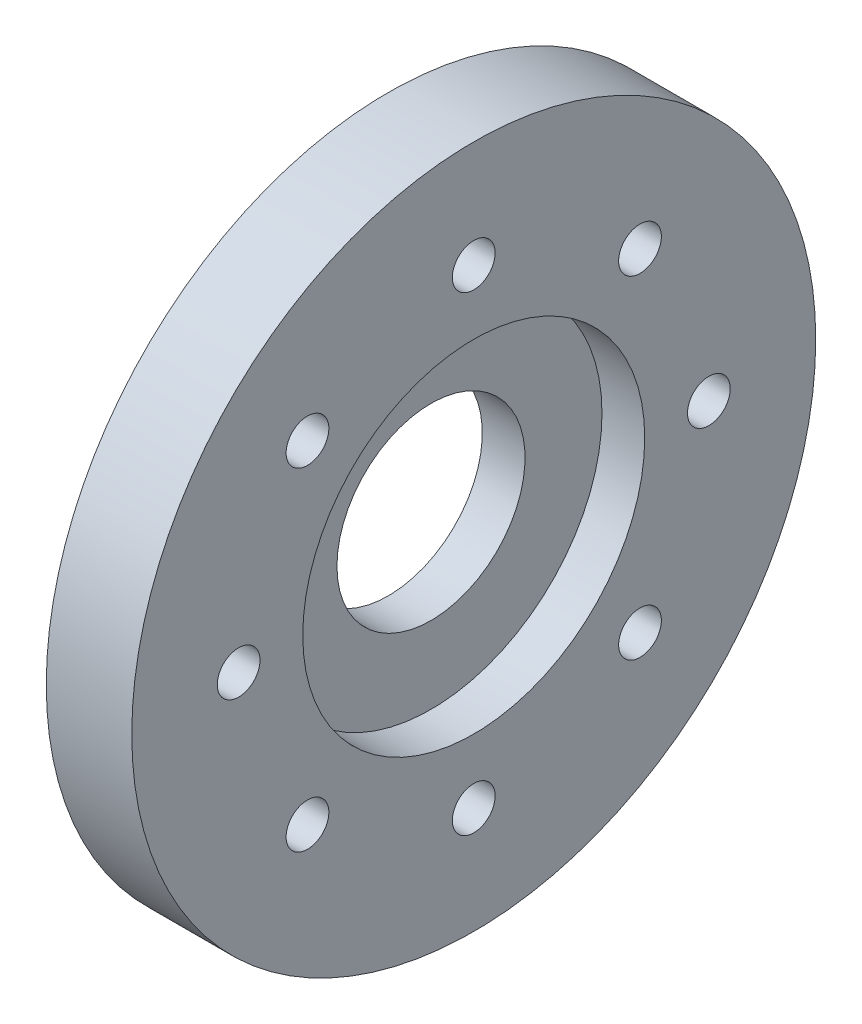
ISO-10303-21;
HEADER;
FILE_DESCRIPTION(('STEP AP214'),'2;1');
FILE_NAME('part.step','',(''),(''),'','','');
FILE_SCHEMA(('AUTOMOTIVE_DESIGN { 1 0 10303 214 1 1 1 1 }'));
ENDSEC;
DATA;
#1=APPLICATION_CONTEXT('core data for automotive mechanical design processes');
#2=APPLICATION_PROTOCOL_DEFINITION('international standard','automotive_design',2000,#1);
#3=PRODUCT_CONTEXT('',#1,'mechanical');
#4=PRODUCT('Part','Part','',(#3));
#5=PRODUCT_RELATED_PRODUCT_CATEGORY('part','',(#4));
#6=PRODUCT_DEFINITION_FORMATION('','',#4);
#7=PRODUCT_DEFINITION_CONTEXT('part definition',#1,'design');
#8=PRODUCT_DEFINITION('design','',#6,#7);
#9=PRODUCT_DEFINITION_SHAPE('','',#8);
#10=(LENGTH_UNIT() NAMED_UNIT(*) SI_UNIT(.MILLI.,.METRE.));
#11=(NAMED_UNIT(*) PLANE_ANGLE_UNIT() SI_UNIT($,.RADIAN.));
#12=(NAMED_UNIT(*) SI_UNIT($,.STERADIAN.) SOLID_ANGLE_UNIT());
#13=UNCERTAINTY_MEASURE_WITH_UNIT(LENGTH_MEASURE(1.E-05),#10,'distance_accuracy_value','');
#14=(GEOMETRIC_REPRESENTATION_CONTEXT(3) GLOBAL_UNCERTAINTY_ASSIGNED_CONTEXT((#13)) GLOBAL_UNIT_ASSIGNED_CONTEXT((#10,
#11,#12)) REPRESENTATION_CONTEXT('',''));
#15=CARTESIAN_POINT('',(0.,0.,0.));
#16=DIRECTION('',(0.,0.,1.));
#17=DIRECTION('',(1.,0.,0.));
#18=AXIS2_PLACEMENT_3D('',#15,#16,#17);
#19=CARTESIAN_POINT('',(-7.44999999999999,0.,0.));
#20=DIRECTION('',(-1.,0.,0.));
#21=DIRECTION('',(0.,0.,1.));
#22=AXIS2_PLACEMENT_3D('',#19,#20,#21);
#23=CYLINDRICAL_SURFACE('',#22,20.);
#24=CARTESIAN_POINT('',(2.55,0.,0.));
#25=DIRECTION('',(-1.,0.,0.));
#26=DIRECTION('',(0.,0.,1.));
#27=AXIS2_PLACEMENT_3D('',#24,#25,#26);
#28=CIRCLE('',#27,20.);
#29=CARTESIAN_POINT('',(2.55,0.,20.));
#30=VERTEX_POINT('',#29);
#31=EDGE_CURVE('E10',#30,#30,#28,.T.);
#32=ORIENTED_EDGE('',*,*,#31,.F.);
#33=EDGE_LOOP('',(#32));
#34=FACE_BOUND('',#33,.T.);
#35=CARTESIAN_POINT('',(-2.45,0.,0.));
#36=DIRECTION('',(-1.,0.,0.));
#37=DIRECTION('',(0.,0.,1.));
#38=AXIS2_PLACEMENT_3D('',#35,#36,#37);
#39=CIRCLE('',#38,20.);
#40=CARTESIAN_POINT('',(-2.45,0.,20.));
#41=VERTEX_POINT('',#40);
#42=EDGE_CURVE('E55',#41,#41,#39,.T.);
#43=ORIENTED_EDGE('',*,*,#42,.T.);
#44=EDGE_LOOP('',(#43));
#45=FACE_BOUND('',#44,.T.);
#46=ADVANCED_FACE('F33',(#34,#45),#23,.F.);
#47=CARTESIAN_POINT('',(2.55,0.,0.));
#48=DIRECTION('',(-1.,0.,0.));
#49=DIRECTION('',(0.,0.,1.));
#50=AXIS2_PLACEMENT_3D('',#47,#48,#49);
#51=PLANE('',#50);
#52=CARTESIAN_POINT('',(2.55,0.,27.5));
#53=DIRECTION('',(1.,0.,0.));
#54=DIRECTION('',(0.,0.,-1.));
#55=AXIS2_PLACEMENT_3D('',#52,#53,#54);
#56=CIRCLE('',#55,2.5);
#57=CARTESIAN_POINT('',(2.55,0.,25.));
#58=VERTEX_POINT('',#57);
#59=EDGE_CURVE('E84',#58,#58,#56,.T.);
#60=ORIENTED_EDGE('',*,*,#59,.F.);
#61=EDGE_LOOP('',(#60));
#62=FACE_BOUND('',#61,.T.);
#63=CARTESIAN_POINT('',(2.55,19.4454364826301,19.44543648263));
#64=DIRECTION('',(1.,0.,0.));
#65=DIRECTION('',(0.,0.,-1.));
#66=AXIS2_PLACEMENT_3D('',#63,#64,#65);
#67=CIRCLE('',#66,2.5);
#68=CARTESIAN_POINT('',(2.55,19.4454364826301,16.94543648263));
#69=VERTEX_POINT('',#68);
#70=EDGE_CURVE('E78',#69,#69,#67,.T.);
#71=ORIENTED_EDGE('',*,*,#70,.F.);
#72=EDGE_LOOP('',(#71));
#73=FACE_BOUND('',#72,.T.);
#74=CARTESIAN_POINT('',(2.55,27.5,-1.37043154602168E-13));
#75=DIRECTION('',(1.,0.,0.));
#76=DIRECTION('',(0.,0.,-1.));
#77=AXIS2_PLACEMENT_3D('',#74,#75,#76);
#78=CIRCLE('',#77,2.5);
#79=CARTESIAN_POINT('',(2.55,27.5,-2.50000000000014));
#80=VERTEX_POINT('',#79);
#81=EDGE_CURVE('E72',#80,#80,#78,.T.);
#82=ORIENTED_EDGE('',*,*,#81,.F.);
#83=EDGE_LOOP('',(#82));
#84=FACE_BOUND('',#83,.T.);
#85=CARTESIAN_POINT('',(2.55,19.4454364826299,-19.4454364826302));
#86=DIRECTION('',(1.,0.,0.));
#87=DIRECTION('',(0.,0.,-1.));
#88=AXIS2_PLACEMENT_3D('',#85,#86,#87);
#89=CIRCLE('',#88,2.5);
#90=CARTESIAN_POINT('',(2.55,19.4454364826299,-21.9454364826302));
#91=VERTEX_POINT('',#90);
#92=EDGE_CURVE('E65',#91,#91,#89,.T.);
#93=ORIENTED_EDGE('',*,*,#92,.F.);
#94=EDGE_LOOP('',(#93));
#95=FACE_BOUND('',#94,.T.);
#96=CARTESIAN_POINT('',(2.55,-2.32452945780892E-13,-27.5));
#97=DIRECTION('',(1.,0.,0.));
#98=DIRECTION('',(0.,0.,-1.));
#99=AXIS2_PLACEMENT_3D('',#96,#97,#98);
#100=CIRCLE('',#99,2.5);
#101=CARTESIAN_POINT('',(2.55,-2.32452945780892E-13,-30.));
#102=VERTEX_POINT('',#101);
#103=EDGE_CURVE('E101',#102,#102,#100,.T.);
#104=ORIENTED_EDGE('',*,*,#103,.F.);
#105=EDGE_LOOP('',(#104));
#106=FACE_BOUND('',#105,.T.);
#107=CARTESIAN_POINT('',(2.55,-19.4454364826303,-19.4454364826299));
#108=DIRECTION('',(1.,0.,0.));
#109=DIRECTION('',(0.,0.,-1.));
#110=AXIS2_PLACEMENT_3D('',#107,#108,#109);
#111=CIRCLE('',#110,2.5);
#112=CARTESIAN_POINT('',(2.55,-19.4454364826303,-21.9454364826299));
#113=VERTEX_POINT('',#112);
#114=EDGE_CURVE('E95',#113,#113,#111,.T.);
#115=ORIENTED_EDGE('',*,*,#114,.F.);
#116=EDGE_LOOP('',(#115));
#117=FACE_BOUND('',#116,.T.);
#118=CARTESIAN_POINT('',(2.55,-27.5,3.24393290007663E-13));
#119=DIRECTION('',(1.,0.,0.));
#120=DIRECTION('',(0.,0.,-1.));
#121=AXIS2_PLACEMENT_3D('',#118,#119,#120);
#122=CIRCLE('',#121,2.5);
#123=CARTESIAN_POINT('',(2.55,-27.5,-2.49999999999967));
#124=VERTEX_POINT('',#123);
#125=EDGE_CURVE('E89',#124,#124,#122,.T.);
#126=ORIENTED_EDGE('',*,*,#125,.F.);
#127=EDGE_LOOP('',(#126));
#128=FACE_BOUND('',#127,.T.);
#129=CARTESIAN_POINT('',(2.55,-19.4454364826301,19.4454364826301));
#130=DIRECTION('',(1.,0.,0.));
#131=DIRECTION('',(0.,0.,-1.));
#132=AXIS2_PLACEMENT_3D('',#129,#130,#131);
#133=CIRCLE('',#132,2.5);
#134=CARTESIAN_POINT('',(2.55,-19.4454364826301,16.94543648263));
#135=VERTEX_POINT('',#134);
#136=EDGE_CURVE('E59',#135,#135,#133,.T.);
#137=ORIENTED_EDGE('',*,*,#136,.F.);
#138=EDGE_LOOP('',(#137));
#139=FACE_BOUND('',#138,.T.);
#140=CARTESIAN_POINT('',(2.55,0.,0.));
#141=DIRECTION('',(-1.,0.,0.));
#142=DIRECTION('',(0.,0.,1.));
#143=AXIS2_PLACEMENT_3D('',#140,#141,#142);
#144=CIRCLE('',#143,40.);
#145=CARTESIAN_POINT('',(2.55,0.,40.));
#146=VERTEX_POINT('',#145);
#147=EDGE_CURVE('E39',#146,#146,#144,.T.);
#148=ORIENTED_EDGE('',*,*,#147,.F.);
#149=EDGE_LOOP('',(#148));
#150=FACE_BOUND('',#149,.T.);
#151=ORIENTED_EDGE('',*,*,#31,.T.);
#152=EDGE_LOOP('',(#151));
#153=FACE_BOUND('',#152,.T.);
#154=ADVANCED_FACE('F118',(#62,#73,#84,#95,#106,#117,#128,#139,#150,#153),#51,.F.);
#155=CARTESIAN_POINT('',(-7.44999999999999,0.,0.));
#156=DIRECTION('',(-1.,0.,0.));
#157=DIRECTION('',(0.,0.,1.));
#158=AXIS2_PLACEMENT_3D('',#155,#156,#157);
#159=CYLINDRICAL_SURFACE('',#158,40.);
#160=CARTESIAN_POINT('',(-7.45,0.,0.));
#161=DIRECTION('',(-1.,0.,0.));
#162=DIRECTION('',(0.,0.,1.));
#163=AXIS2_PLACEMENT_3D('',#160,#161,#162);
#164=CIRCLE('',#163,40.);
#165=CARTESIAN_POINT('',(-7.45,0.,40.));
#166=VERTEX_POINT('',#165);
#167=EDGE_CURVE('E43',#166,#166,#164,.T.);
#168=ORIENTED_EDGE('',*,*,#167,.F.);
#169=EDGE_LOOP('',(#168));
#170=FACE_BOUND('',#169,.T.);
#171=ORIENTED_EDGE('',*,*,#147,.T.);
#172=EDGE_LOOP('',(#171));
#173=FACE_BOUND('',#172,.T.);
#174=ADVANCED_FACE('F121',(#170,#173),#159,.T.);
#175=CARTESIAN_POINT('',(-7.45,0.,0.));
#176=DIRECTION('',(1.,0.,0.));
#177=DIRECTION('',(0.,0.,-1.));
#178=AXIS2_PLACEMENT_3D('',#175,#176,#177);
#179=PLANE('',#178);
#180=CARTESIAN_POINT('',(-7.45,0.,27.5));
#181=DIRECTION('',(1.,0.,0.));
#182=DIRECTION('',(0.,0.,-1.));
#183=AXIS2_PLACEMENT_3D('',#180,#181,#182);
#184=CIRCLE('',#183,2.5);
#185=CARTESIAN_POINT('',(-7.45,0.,25.));
#186=VERTEX_POINT('',#185);
#187=EDGE_CURVE('E62',#186,#186,#184,.T.);
#188=ORIENTED_EDGE('',*,*,#187,.T.);
#189=EDGE_LOOP('',(#188));
#190=FACE_BOUND('',#189,.T.);
#191=CARTESIAN_POINT('',(-7.45,19.4454364826301,19.44543648263));
#192=DIRECTION('',(1.,0.,0.));
#193=DIRECTION('',(0.,0.,-1.));
#194=AXIS2_PLACEMENT_3D('',#191,#192,#193);
#195=CIRCLE('',#194,2.5);
#196=CARTESIAN_POINT('',(-7.45,19.4454364826301,16.94543648263));
#197=VERTEX_POINT('',#196);
#198=EDGE_CURVE('E81',#197,#197,#195,.T.);
#199=ORIENTED_EDGE('',*,*,#198,.T.);
#200=EDGE_LOOP('',(#199));
#201=FACE_BOUND('',#200,.T.);
#202=CARTESIAN_POINT('',(-7.45,27.5,-1.37043154602168E-13));
#203=DIRECTION('',(1.,0.,0.));
#204=DIRECTION('',(0.,0.,-1.));
#205=AXIS2_PLACEMENT_3D('',#202,#203,#204);
#206=CIRCLE('',#205,2.5);
#207=CARTESIAN_POINT('',(-7.45,27.5,-2.50000000000014));
#208=VERTEX_POINT('',#207);
#209=EDGE_CURVE('E75',#208,#208,#206,.T.);
#210=ORIENTED_EDGE('',*,*,#209,.T.);
#211=EDGE_LOOP('',(#210));
#212=FACE_BOUND('',#211,.T.);
#213=CARTESIAN_POINT('',(-7.45,19.4454364826299,-19.4454364826302));
#214=DIRECTION('',(1.,0.,0.));
#215=DIRECTION('',(0.,0.,-1.));
#216=AXIS2_PLACEMENT_3D('',#213,#214,#215);
#217=CIRCLE('',#216,2.5);
#218=CARTESIAN_POINT('',(-7.45,19.4454364826299,-21.9454364826302));
#219=VERTEX_POINT('',#218);
#220=EDGE_CURVE('E68',#219,#219,#217,.T.);
#221=ORIENTED_EDGE('',*,*,#220,.T.);
#222=EDGE_LOOP('',(#221));
#223=FACE_BOUND('',#222,.T.);
#224=CARTESIAN_POINT('',(-7.45,-2.32452945780892E-13,-27.5));
#225=DIRECTION('',(1.,0.,0.));
#226=DIRECTION('',(0.,0.,-1.));
#227=AXIS2_PLACEMENT_3D('',#224,#225,#226);
#228=CIRCLE('',#227,2.5);
#229=CARTESIAN_POINT('',(-7.45,-2.32452945780892E-13,-30.));
#230=VERTEX_POINT('',#229);
#231=EDGE_CURVE('E69',#230,#230,#228,.T.);
#232=ORIENTED_EDGE('',*,*,#231,.T.);
#233=EDGE_LOOP('',(#232));
#234=FACE_BOUND('',#233,.T.);
#235=CARTESIAN_POINT('',(-7.45,-19.4454364826303,-19.4454364826299));
#236=DIRECTION('',(1.,0.,0.));
#237=DIRECTION('',(0.,0.,-1.));
#238=AXIS2_PLACEMENT_3D('',#235,#236,#237);
#239=CIRCLE('',#238,2.5);
#240=CARTESIAN_POINT('',(-7.45,-19.4454364826303,-21.9454364826299));
#241=VERTEX_POINT('',#240);
#242=EDGE_CURVE('E98',#241,#241,#239,.T.);
#243=ORIENTED_EDGE('',*,*,#242,.T.);
#244=EDGE_LOOP('',(#243));
#245=FACE_BOUND('',#244,.T.);
#246=CARTESIAN_POINT('',(-7.45,-27.5,3.24393290007663E-13));
#247=DIRECTION('',(1.,0.,0.));
#248=DIRECTION('',(0.,0.,-1.));
#249=AXIS2_PLACEMENT_3D('',#246,#247,#248);
#250=CIRCLE('',#249,2.5);
#251=CARTESIAN_POINT('',(-7.45,-27.5,-2.49999999999967));
#252=VERTEX_POINT('',#251);
#253=EDGE_CURVE('E92',#252,#252,#250,.T.);
#254=ORIENTED_EDGE('',*,*,#253,.T.);
#255=EDGE_LOOP('',(#254));
#256=FACE_BOUND('',#255,.T.);
#257=CARTESIAN_POINT('',(-7.45,-19.4454364826301,19.4454364826301));
#258=DIRECTION('',(1.,0.,0.));
#259=DIRECTION('',(0.,0.,-1.));
#260=AXIS2_PLACEMENT_3D('',#257,#258,#259);
#261=CIRCLE('',#260,2.5);
#262=CARTESIAN_POINT('',(-7.45,-19.4454364826301,16.94543648263));
#263=VERTEX_POINT('',#262);
#264=EDGE_CURVE('E58',#263,#263,#261,.T.);
#265=ORIENTED_EDGE('',*,*,#264,.T.);
#266=EDGE_LOOP('',(#265));
#267=FACE_BOUND('',#266,.T.);
#268=CARTESIAN_POINT('',(-7.45,0.,0.));
#269=DIRECTION('',(-1.,0.,0.));
#270=DIRECTION('',(0.,0.,1.));
#271=AXIS2_PLACEMENT_3D('',#268,#269,#270);
#272=CIRCLE('',#271,11.);
#273=CARTESIAN_POINT('',(-7.45,0.,11.));
#274=VERTEX_POINT('',#273);
#275=EDGE_CURVE('E47',#274,#274,#272,.T.);
#276=ORIENTED_EDGE('',*,*,#275,.F.);
#277=EDGE_LOOP('',(#276));
#278=FACE_BOUND('',#277,.T.);
#279=ORIENTED_EDGE('',*,*,#167,.T.);
#280=EDGE_LOOP('',(#279));
#281=FACE_BOUND('',#280,.T.);
#282=ADVANCED_FACE('F107',(#190,#201,#212,#223,#234,#245,#256,#267,#278,#281),#179,.F.);
#283=CARTESIAN_POINT('',(-7.44999999999999,0.,0.));
#284=DIRECTION('',(-1.,0.,0.));
#285=DIRECTION('',(0.,0.,1.));
#286=AXIS2_PLACEMENT_3D('',#283,#284,#285);
#287=CYLINDRICAL_SURFACE('',#286,11.);
#288=ORIENTED_EDGE('',*,*,#275,.T.);
#289=EDGE_LOOP('',(#288));
#290=FACE_BOUND('',#289,.T.);
#291=CARTESIAN_POINT('',(-2.45,0.,0.));
#292=DIRECTION('',(-1.,0.,0.));
#293=DIRECTION('',(0.,0.,1.));
#294=AXIS2_PLACEMENT_3D('',#291,#292,#293);
#295=CIRCLE('',#294,11.);
#296=CARTESIAN_POINT('',(-2.45,0.,11.));
#297=VERTEX_POINT('',#296);
#298=EDGE_CURVE('E52',#297,#297,#295,.T.);
#299=ORIENTED_EDGE('',*,*,#298,.F.);
#300=EDGE_LOOP('',(#299));
#301=FACE_BOUND('',#300,.T.);
#302=ADVANCED_FACE('F142',(#290,#301),#287,.F.);
#303=CARTESIAN_POINT('',(-2.45,0.,0.));
#304=DIRECTION('',(-1.,0.,0.));
#305=DIRECTION('',(0.,0.,1.));
#306=AXIS2_PLACEMENT_3D('',#303,#304,#305);
#307=PLANE('',#306);
#308=ORIENTED_EDGE('',*,*,#42,.F.);
#309=EDGE_LOOP('',(#308));
#310=FACE_BOUND('',#309,.T.);
#311=ORIENTED_EDGE('',*,*,#298,.T.);
#312=EDGE_LOOP('',(#311));
#313=FACE_BOUND('',#312,.T.);
#314=ADVANCED_FACE('F133',(#310,#313),#307,.F.);
#315=CARTESIAN_POINT('',(-7.45,-19.4454364826301,19.4454364826301));
#316=DIRECTION('',(1.,0.,0.));
#317=DIRECTION('',(0.,0.,-1.));
#318=AXIS2_PLACEMENT_3D('',#315,#316,#317);
#319=CYLINDRICAL_SURFACE('',#318,2.5);
#320=ORIENTED_EDGE('',*,*,#264,.F.);
#321=EDGE_LOOP('',(#320));
#322=FACE_BOUND('',#321,.T.);
#323=ORIENTED_EDGE('',*,*,#136,.T.);
#324=EDGE_LOOP('',(#323));
#325=FACE_BOUND('',#324,.T.);
#326=ADVANCED_FACE('F130',(#322,#325),#319,.F.);
#327=CARTESIAN_POINT('',(-7.45,-27.5,3.24393290007663E-13));
#328=DIRECTION('',(1.,0.,0.));
#329=DIRECTION('',(0.,0.,-1.));
#330=AXIS2_PLACEMENT_3D('',#327,#328,#329);
#331=CYLINDRICAL_SURFACE('',#330,2.5);
#332=ORIENTED_EDGE('',*,*,#253,.F.);
#333=EDGE_LOOP('',(#332));
#334=FACE_BOUND('',#333,.T.);
#335=ORIENTED_EDGE('',*,*,#125,.T.);
#336=EDGE_LOOP('',(#335));
#337=FACE_BOUND('',#336,.T.);
#338=ADVANCED_FACE('F132',(#334,#337),#331,.F.);
#339=CARTESIAN_POINT('',(-7.45,-19.4454364826303,-19.4454364826299));
#340=DIRECTION('',(1.,0.,0.));
#341=DIRECTION('',(0.,0.,-1.));
#342=AXIS2_PLACEMENT_3D('',#339,#340,#341);
#343=CYLINDRICAL_SURFACE('',#342,2.5);
#344=ORIENTED_EDGE('',*,*,#242,.F.);
#345=EDGE_LOOP('',(#344));
#346=FACE_BOUND('',#345,.T.);
#347=ORIENTED_EDGE('',*,*,#114,.T.);
#348=EDGE_LOOP('',(#347));
#349=FACE_BOUND('',#348,.T.);
#350=ADVANCED_FACE('F114',(#346,#349),#343,.F.);
#351=CARTESIAN_POINT('',(-7.45,-2.32452945780892E-13,-27.5));
#352=DIRECTION('',(1.,0.,0.));
#353=DIRECTION('',(0.,0.,-1.));
#354=AXIS2_PLACEMENT_3D('',#351,#352,#353);
#355=CYLINDRICAL_SURFACE('',#354,2.5);
#356=ORIENTED_EDGE('',*,*,#231,.F.);
#357=EDGE_LOOP('',(#356));
#358=FACE_BOUND('',#357,.T.);
#359=ORIENTED_EDGE('',*,*,#103,.T.);
#360=EDGE_LOOP('',(#359));
#361=FACE_BOUND('',#360,.T.);
#362=ADVANCED_FACE('F110',(#358,#361),#355,.F.);
#363=CARTESIAN_POINT('',(-7.45,19.4454364826299,-19.4454364826302));
#364=DIRECTION('',(1.,0.,0.));
#365=DIRECTION('',(0.,0.,-1.));
#366=AXIS2_PLACEMENT_3D('',#363,#364,#365);
#367=CYLINDRICAL_SURFACE('',#366,2.5);
#368=ORIENTED_EDGE('',*,*,#220,.F.);
#369=EDGE_LOOP('',(#368));
#370=FACE_BOUND('',#369,.T.);
#371=ORIENTED_EDGE('',*,*,#92,.T.);
#372=EDGE_LOOP('',(#371));
#373=FACE_BOUND('',#372,.T.);
#374=ADVANCED_FACE('F113',(#370,#373),#367,.F.);
#375=CARTESIAN_POINT('',(-7.45,27.5,-1.37043154602168E-13));
#376=DIRECTION('',(1.,0.,0.));
#377=DIRECTION('',(0.,0.,-1.));
#378=AXIS2_PLACEMENT_3D('',#375,#376,#377);
#379=CYLINDRICAL_SURFACE('',#378,2.5);
#380=ORIENTED_EDGE('',*,*,#209,.F.);
#381=EDGE_LOOP('',(#380));
#382=FACE_BOUND('',#381,.T.);
#383=ORIENTED_EDGE('',*,*,#81,.T.);
#384=EDGE_LOOP('',(#383));
#385=FACE_BOUND('',#384,.T.);
#386=ADVANCED_FACE('F216',(#382,#385),#379,.F.);
#387=CARTESIAN_POINT('',(-7.45,19.4454364826301,19.44543648263));
#388=DIRECTION('',(1.,0.,0.));
#389=DIRECTION('',(0.,0.,-1.));
#390=AXIS2_PLACEMENT_3D('',#387,#388,#389);
#391=CYLINDRICAL_SURFACE('',#390,2.5);
#392=ORIENTED_EDGE('',*,*,#198,.F.);
#393=EDGE_LOOP('',(#392));
#394=FACE_BOUND('',#393,.T.);
#395=ORIENTED_EDGE('',*,*,#70,.T.);
#396=EDGE_LOOP('',(#395));
#397=FACE_BOUND('',#396,.T.);
#398=ADVANCED_FACE('F225',(#394,#397),#391,.F.);
#399=CARTESIAN_POINT('',(-7.45,0.,27.5));
#400=DIRECTION('',(1.,0.,0.));
#401=DIRECTION('',(0.,0.,-1.));
#402=AXIS2_PLACEMENT_3D('',#399,#400,#401);
#403=CYLINDRICAL_SURFACE('',#402,2.5);
#404=ORIENTED_EDGE('',*,*,#187,.F.);
#405=EDGE_LOOP('',(#404));
#406=FACE_BOUND('',#405,.T.);
#407=ORIENTED_EDGE('',*,*,#59,.T.);
#408=EDGE_LOOP('',(#407));
#409=FACE_BOUND('',#408,.T.);
#410=ADVANCED_FACE('F235',(#406,#409),#403,.F.);
#411=CLOSED_SHELL('',(#46,#154,#174,#282,#302,#314,#326,#338,#350,#362,#374,#386,#398,#410));
#412=MANIFOLD_SOLID_BREP('B2',#411);
#413=ADVANCED_BREP_SHAPE_REPRESENTATION('',(#18,#412),#14);
#414=SHAPE_DEFINITION_REPRESENTATION(#9,#413);
ENDSEC;
END-ISO-10303-21;
